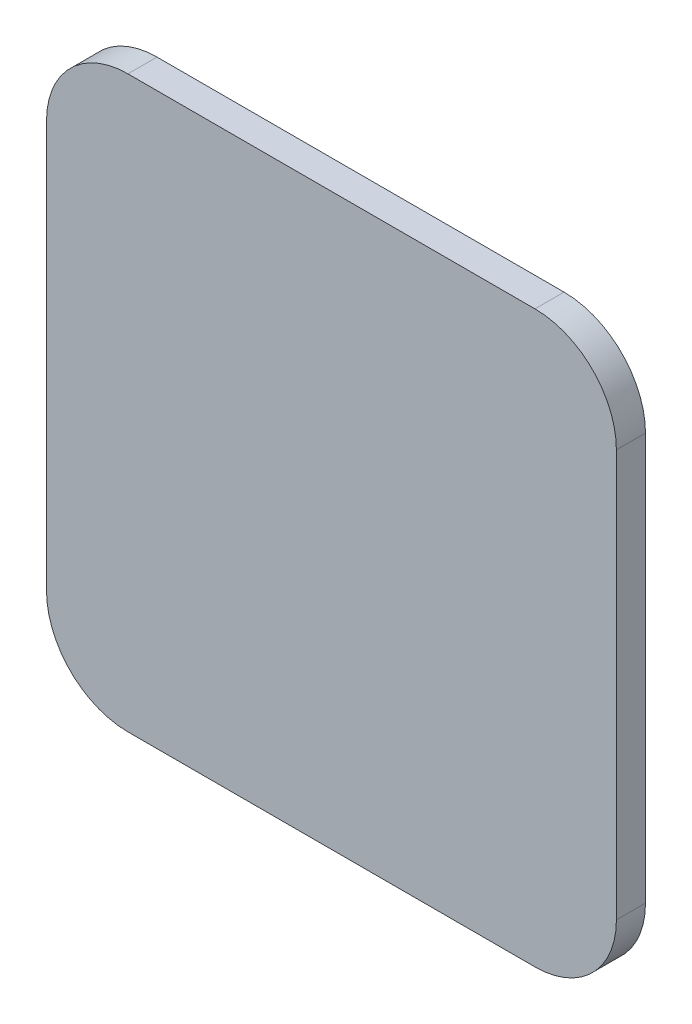
ISO-10303-21;
HEADER;
FILE_DESCRIPTION(('STEP AP214'),'2;1');
FILE_NAME('part.step','',(''),(''),'','','');
FILE_SCHEMA(('AUTOMOTIVE_DESIGN { 1 0 10303 214 1 1 1 1 }'));
ENDSEC;
DATA;
#1=APPLICATION_CONTEXT('core data for automotive mechanical design processes');
#2=APPLICATION_PROTOCOL_DEFINITION('international standard','automotive_design',2000,#1);
#3=PRODUCT_CONTEXT('',#1,'mechanical');
#4=PRODUCT('Part','Part','',(#3));
#5=PRODUCT_RELATED_PRODUCT_CATEGORY('part','',(#4));
#6=PRODUCT_DEFINITION_FORMATION('','',#4);
#7=PRODUCT_DEFINITION_CONTEXT('part definition',#1,'design');
#8=PRODUCT_DEFINITION('design','',#6,#7);
#9=PRODUCT_DEFINITION_SHAPE('','',#8);
#10=(LENGTH_UNIT() NAMED_UNIT(*) SI_UNIT(.MILLI.,.METRE.));
#11=(NAMED_UNIT(*) PLANE_ANGLE_UNIT() SI_UNIT($,.RADIAN.));
#12=(NAMED_UNIT(*) SI_UNIT($,.STERADIAN.) SOLID_ANGLE_UNIT());
#13=UNCERTAINTY_MEASURE_WITH_UNIT(LENGTH_MEASURE(1.E-05),#10,'distance_accuracy_value','');
#14=(GEOMETRIC_REPRESENTATION_CONTEXT(3) GLOBAL_UNCERTAINTY_ASSIGNED_CONTEXT((#13)) GLOBAL_UNIT_ASSIGNED_CONTEXT((#10,
#11,#12)) REPRESENTATION_CONTEXT('',''));
#15=CARTESIAN_POINT('',(0.,0.,0.));
#16=DIRECTION('',(0.,0.,1.));
#17=DIRECTION('',(1.,0.,0.));
#18=AXIS2_PLACEMENT_3D('',#15,#16,#17);
#19=CARTESIAN_POINT('',(0.,-53.086,-1.27));
#20=DIRECTION('',(0.,1.,0.));
#21=DIRECTION('',(-1.,0.,0.));
#22=AXIS2_PLACEMENT_3D('',#19,#20,#21);
#23=PLANE('',#22);
#24=DIRECTION('',(-1.,0.,0.));
#25=VECTOR('',#24,1.);
#26=CARTESIAN_POINT('',(0.,-53.086,0.));
#27=LINE('',#26,#25);
#28=CARTESIAN_POINT('',(5.69272615384614,-53.086,0.));
#29=VERTEX_POINT('',#28);
#30=CARTESIAN_POINT('',(-12.0872738461538,-53.086,0.));
#31=VERTEX_POINT('',#30);
#32=EDGE_CURVE('E149',#29,#31,#27,.T.);
#33=ORIENTED_EDGE('',*,*,#32,.T.);
#34=DIRECTION('',(0.,0.,1.));
#35=VECTOR('',#34,1.);
#36=CARTESIAN_POINT('',(-12.0872738461538,-53.086,-1.27));
#37=LINE('',#36,#35);
#38=CARTESIAN_POINT('',(-12.0872738461538,-53.086,-1.27));
#39=VERTEX_POINT('',#38);
#40=EDGE_CURVE('E11',#39,#31,#37,.T.);
#41=ORIENTED_EDGE('',*,*,#40,.F.);
#42=DIRECTION('',(-1.,0.,0.));
#43=VECTOR('',#42,1.);
#44=CARTESIAN_POINT('',(0.,-53.086,-1.27));
#45=LINE('',#44,#43);
#46=CARTESIAN_POINT('',(5.69272615384614,-53.086,-1.27));
#47=VERTEX_POINT('',#46);
#48=EDGE_CURVE('E183',#47,#39,#45,.T.);
#49=ORIENTED_EDGE('',*,*,#48,.F.);
#50=DIRECTION('',(0.,0.,1.));
#51=VECTOR('',#50,1.);
#52=CARTESIAN_POINT('',(5.69272615384614,-53.086,-1.27));
#53=LINE('',#52,#51);
#54=EDGE_CURVE('E38',#47,#29,#53,.T.);
#55=ORIENTED_EDGE('',*,*,#54,.T.);
#56=EDGE_LOOP('',(#33,#41,#49,#55));
#57=FACE_BOUND('',#56,.T.);
#58=ADVANCED_FACE('F35',(#57),#23,.F.);
#59=CARTESIAN_POINT('',(-12.0872738461538,-49.53,-1.27));
#60=DIRECTION('',(0.,0.,1.));
#61=DIRECTION('',(1.,0.,0.));
#62=AXIS2_PLACEMENT_3D('',#59,#60,#61);
#63=CYLINDRICAL_SURFACE('',#62,3.556);
#64=CARTESIAN_POINT('',(-12.0872738461538,-49.53,0.));
#65=DIRECTION('',(0.,0.,1.));
#66=DIRECTION('',(1.,0.,0.));
#67=AXIS2_PLACEMENT_3D('',#64,#65,#66);
#68=CIRCLE('',#67,3.556);
#69=CARTESIAN_POINT('',(-15.6432738461538,-49.53,0.));
#70=VERTEX_POINT('',#69);
#71=EDGE_CURVE('E93',#31,#70,#68,.F.);
#72=ORIENTED_EDGE('',*,*,#71,.T.);
#73=DIRECTION('',(0.,0.,1.));
#74=VECTOR('',#73,1.);
#75=CARTESIAN_POINT('',(-15.6432738461538,-49.53,-1.27));
#76=LINE('',#75,#74);
#77=CARTESIAN_POINT('',(-15.6432738461538,-49.53,-1.27));
#78=VERTEX_POINT('',#77);
#79=EDGE_CURVE('E43',#78,#70,#76,.T.);
#80=ORIENTED_EDGE('',*,*,#79,.F.);
#81=CARTESIAN_POINT('',(-12.0872738461538,-49.53,-1.27));
#82=DIRECTION('',(0.,0.,1.));
#83=DIRECTION('',(1.,0.,0.));
#84=AXIS2_PLACEMENT_3D('',#81,#82,#83);
#85=CIRCLE('',#84,3.556);
#86=EDGE_CURVE('E59',#39,#78,#85,.F.);
#87=ORIENTED_EDGE('',*,*,#86,.F.);
#88=ORIENTED_EDGE('',*,*,#40,.T.);
#89=EDGE_LOOP('',(#72,#80,#87,#88));
#90=FACE_BOUND('',#89,.T.);
#91=ADVANCED_FACE('F199',(#90),#63,.T.);
#92=CARTESIAN_POINT('',(-15.6432738461538,0.,-1.27));
#93=DIRECTION('',(-1.,0.,0.));
#94=DIRECTION('',(0.,-1.,0.));
#95=AXIS2_PLACEMENT_3D('',#92,#93,#94);
#96=PLANE('',#95);
#97=DIRECTION('',(0.,-1.,0.));
#98=VECTOR('',#97,1.);
#99=CARTESIAN_POINT('',(-15.6432738461538,0.,0.));
#100=LINE('',#99,#98);
#101=CARTESIAN_POINT('',(-15.6432738461538,-31.75,0.));
#102=VERTEX_POINT('',#101);
#103=EDGE_CURVE('E127',#102,#70,#100,.T.);
#104=ORIENTED_EDGE('',*,*,#103,.F.);
#105=DIRECTION('',(0.,0.,1.));
#106=VECTOR('',#105,1.);
#107=CARTESIAN_POINT('',(-15.6432738461538,-31.75,-1.27));
#108=LINE('',#107,#106);
#109=CARTESIAN_POINT('',(-15.6432738461538,-31.75,-1.27));
#110=VERTEX_POINT('',#109);
#111=EDGE_CURVE('E123',#110,#102,#108,.T.);
#112=ORIENTED_EDGE('',*,*,#111,.F.);
#113=DIRECTION('',(0.,-1.,0.));
#114=VECTOR('',#113,1.);
#115=CARTESIAN_POINT('',(-15.6432738461538,0.,-1.27));
#116=LINE('',#115,#114);
#117=EDGE_CURVE('E126',#110,#78,#116,.T.);
#118=ORIENTED_EDGE('',*,*,#117,.T.);
#119=ORIENTED_EDGE('',*,*,#79,.T.);
#120=EDGE_LOOP('',(#104,#112,#118,#119));
#121=FACE_BOUND('',#120,.T.);
#122=ADVANCED_FACE('F125',(#121),#96,.T.);
#123=CARTESIAN_POINT('',(-12.0872738461538,-31.75,-1.27));
#124=DIRECTION('',(0.,0.,1.));
#125=DIRECTION('',(1.,0.,0.));
#126=AXIS2_PLACEMENT_3D('',#123,#124,#125);
#127=CYLINDRICAL_SURFACE('',#126,3.556);
#128=CARTESIAN_POINT('',(-12.0872738461538,-31.75,0.));
#129=DIRECTION('',(0.,0.,1.));
#130=DIRECTION('',(1.,0.,0.));
#131=AXIS2_PLACEMENT_3D('',#128,#129,#130);
#132=CIRCLE('',#131,3.556);
#133=CARTESIAN_POINT('',(-12.0872738461538,-28.194,0.));
#134=VERTEX_POINT('',#133);
#135=EDGE_CURVE('E165',#134,#102,#132,.T.);
#136=ORIENTED_EDGE('',*,*,#135,.F.);
#137=DIRECTION('',(0.,0.,1.));
#138=VECTOR('',#137,1.);
#139=CARTESIAN_POINT('',(-12.0872738461538,-28.194,-1.27));
#140=LINE('',#139,#138);
#141=CARTESIAN_POINT('',(-12.0872738461538,-28.194,-1.27));
#142=VERTEX_POINT('',#141);
#143=EDGE_CURVE('E132',#142,#134,#140,.T.);
#144=ORIENTED_EDGE('',*,*,#143,.F.);
#145=CARTESIAN_POINT('',(-12.0872738461538,-31.75,-1.27));
#146=DIRECTION('',(0.,0.,1.));
#147=DIRECTION('',(1.,0.,0.));
#148=AXIS2_PLACEMENT_3D('',#145,#146,#147);
#149=CIRCLE('',#148,3.556);
#150=EDGE_CURVE('E138',#142,#110,#149,.T.);
#151=ORIENTED_EDGE('',*,*,#150,.T.);
#152=ORIENTED_EDGE('',*,*,#111,.T.);
#153=EDGE_LOOP('',(#136,#144,#151,#152));
#154=FACE_BOUND('',#153,.T.);
#155=ADVANCED_FACE('F141',(#154),#127,.T.);
#156=CARTESIAN_POINT('',(0.,-28.194,-1.27));
#157=DIRECTION('',(0.,1.,0.));
#158=DIRECTION('',(0.,0.,1.));
#159=AXIS2_PLACEMENT_3D('',#156,#157,#158);
#160=PLANE('',#159);
#161=DIRECTION('',(-1.,0.,0.));
#162=VECTOR('',#161,1.);
#163=CARTESIAN_POINT('',(0.,-28.194,0.));
#164=LINE('',#163,#162);
#165=CARTESIAN_POINT('',(5.69272615384616,-28.194,0.));
#166=VERTEX_POINT('',#165);
#167=EDGE_CURVE('E162',#166,#134,#164,.T.);
#168=ORIENTED_EDGE('',*,*,#167,.F.);
#169=DIRECTION('',(0.,0.,1.));
#170=VECTOR('',#169,1.);
#171=CARTESIAN_POINT('',(5.69272615384616,-28.194,-1.27));
#172=LINE('',#171,#170);
#173=CARTESIAN_POINT('',(5.69272615384616,-28.194,-1.27));
#174=VERTEX_POINT('',#173);
#175=EDGE_CURVE('E172',#174,#166,#172,.T.);
#176=ORIENTED_EDGE('',*,*,#175,.F.);
#177=DIRECTION('',(-1.,0.,0.));
#178=VECTOR('',#177,1.);
#179=CARTESIAN_POINT('',(0.,-28.194,-1.27));
#180=LINE('',#179,#178);
#181=EDGE_CURVE('E142',#174,#142,#180,.T.);
#182=ORIENTED_EDGE('',*,*,#181,.T.);
#183=ORIENTED_EDGE('',*,*,#143,.T.);
#184=EDGE_LOOP('',(#168,#176,#182,#183));
#185=FACE_BOUND('',#184,.T.);
#186=ADVANCED_FACE('F212',(#185),#160,.T.);
#187=CARTESIAN_POINT('',(5.69272615384616,-31.75,-1.27));
#188=DIRECTION('',(0.,0.,1.));
#189=DIRECTION('',(1.,0.,0.));
#190=AXIS2_PLACEMENT_3D('',#187,#188,#189);
#191=CYLINDRICAL_SURFACE('',#190,3.556);
#192=CARTESIAN_POINT('',(5.69272615384616,-31.75,0.));
#193=DIRECTION('',(0.,0.,1.));
#194=DIRECTION('',(1.,0.,0.));
#195=AXIS2_PLACEMENT_3D('',#192,#193,#194);
#196=CIRCLE('',#195,3.556);
#197=CARTESIAN_POINT('',(9.24872615384616,-31.75,0.));
#198=VERTEX_POINT('',#197);
#199=EDGE_CURVE('E159',#198,#166,#196,.T.);
#200=ORIENTED_EDGE('',*,*,#199,.F.);
#201=DIRECTION('',(0.,0.,1.));
#202=VECTOR('',#201,1.);
#203=CARTESIAN_POINT('',(9.24872615384616,-31.75,-1.27));
#204=LINE('',#203,#202);
#205=CARTESIAN_POINT('',(9.24872615384616,-31.75,-1.27));
#206=VERTEX_POINT('',#205);
#207=EDGE_CURVE('E174',#206,#198,#204,.T.);
#208=ORIENTED_EDGE('',*,*,#207,.F.);
#209=CARTESIAN_POINT('',(5.69272615384616,-31.75,-1.27));
#210=DIRECTION('',(0.,0.,1.));
#211=DIRECTION('',(1.,0.,0.));
#212=AXIS2_PLACEMENT_3D('',#209,#210,#211);
#213=CIRCLE('',#212,3.556);
#214=EDGE_CURVE('E144',#206,#174,#213,.T.);
#215=ORIENTED_EDGE('',*,*,#214,.T.);
#216=ORIENTED_EDGE('',*,*,#175,.T.);
#217=EDGE_LOOP('',(#200,#208,#215,#216));
#218=FACE_BOUND('',#217,.T.);
#219=ADVANCED_FACE('F195',(#218),#191,.T.);
#220=CARTESIAN_POINT('',(9.24872615384615,0.,-1.27));
#221=DIRECTION('',(1.,0.,0.));
#222=DIRECTION('',(0.,1.,0.));
#223=AXIS2_PLACEMENT_3D('',#220,#221,#222);
#224=PLANE('',#223);
#225=DIRECTION('',(0.,1.,0.));
#226=VECTOR('',#225,1.);
#227=CARTESIAN_POINT('',(9.24872615384615,0.,0.));
#228=LINE('',#227,#226);
#229=CARTESIAN_POINT('',(9.24872615384617,-49.53,0.));
#230=VERTEX_POINT('',#229);
#231=EDGE_CURVE('E156',#230,#198,#228,.T.);
#232=ORIENTED_EDGE('',*,*,#231,.F.);
#233=DIRECTION('',(0.,0.,1.));
#234=VECTOR('',#233,1.);
#235=CARTESIAN_POINT('',(9.24872615384617,-49.53,-1.27));
#236=LINE('',#235,#234);
#237=CARTESIAN_POINT('',(9.24872615384617,-49.53,-1.27));
#238=VERTEX_POINT('',#237);
#239=EDGE_CURVE('E175',#238,#230,#236,.T.);
#240=ORIENTED_EDGE('',*,*,#239,.F.);
#241=DIRECTION('',(0.,1.,0.));
#242=VECTOR('',#241,1.);
#243=CARTESIAN_POINT('',(9.24872615384615,0.,-1.27));
#244=LINE('',#243,#242);
#245=EDGE_CURVE('E226',#238,#206,#244,.T.);
#246=ORIENTED_EDGE('',*,*,#245,.T.);
#247=ORIENTED_EDGE('',*,*,#207,.T.);
#248=EDGE_LOOP('',(#232,#240,#246,#247));
#249=FACE_BOUND('',#248,.T.);
#250=ADVANCED_FACE('F188',(#249),#224,.T.);
#251=CARTESIAN_POINT('',(5.69272615384617,-49.53,-1.27));
#252=DIRECTION('',(0.,0.,1.));
#253=DIRECTION('',(1.,0.,0.));
#254=AXIS2_PLACEMENT_3D('',#251,#252,#253);
#255=CYLINDRICAL_SURFACE('',#254,3.556);
#256=CARTESIAN_POINT('',(5.69272615384617,-49.53,0.));
#257=DIRECTION('',(0.,0.,1.));
#258=DIRECTION('',(1.,0.,0.));
#259=AXIS2_PLACEMENT_3D('',#256,#257,#258);
#260=CIRCLE('',#259,3.556);
#261=EDGE_CURVE('E152',#29,#230,#260,.T.);
#262=ORIENTED_EDGE('',*,*,#261,.F.);
#263=ORIENTED_EDGE('',*,*,#54,.F.);
#264=CARTESIAN_POINT('',(5.69272615384617,-49.53,-1.27));
#265=DIRECTION('',(0.,0.,1.));
#266=DIRECTION('',(1.,0.,0.));
#267=AXIS2_PLACEMENT_3D('',#264,#265,#266);
#268=CIRCLE('',#267,3.556);
#269=EDGE_CURVE('E227',#47,#238,#268,.T.);
#270=ORIENTED_EDGE('',*,*,#269,.T.);
#271=ORIENTED_EDGE('',*,*,#239,.T.);
#272=EDGE_LOOP('',(#262,#263,#270,#271));
#273=FACE_BOUND('',#272,.T.);
#274=ADVANCED_FACE('F186',(#273),#255,.T.);
#275=CARTESIAN_POINT('',(0.,0.,-1.27));
#276=DIRECTION('',(0.,0.,1.));
#277=DIRECTION('',(1.,0.,0.));
#278=AXIS2_PLACEMENT_3D('',#275,#276,#277);
#279=PLANE('',#278);
#280=CARTESIAN_POINT('',(5.69272615384617,-49.53,-1.27));
#281=DIRECTION('',(0.,0.,1.));
#282=DIRECTION('',(1.,0.,0.));
#283=AXIS2_PLACEMENT_3D('',#280,#281,#282);
#284=CIRCLE('',#283,0.889);
#285=CARTESIAN_POINT('',(5.69272615384614,-50.419,-1.27));
#286=VERTEX_POINT('',#285);
#287=CARTESIAN_POINT('',(6.58172615384616,-49.53,-1.27));
#288=VERTEX_POINT('',#287);
#289=EDGE_CURVE('E168',#286,#288,#284,.T.);
#290=ORIENTED_EDGE('',*,*,#289,.T.);
#291=DIRECTION('',(0.,1.,0.));
#292=VECTOR('',#291,1.);
#293=CARTESIAN_POINT('',(6.58172615384616,0.,-1.27));
#294=LINE('',#293,#292);
#295=CARTESIAN_POINT('',(6.58172615384616,-31.75,-1.27));
#296=VERTEX_POINT('',#295);
#297=EDGE_CURVE('E232',#288,#296,#294,.T.);
#298=ORIENTED_EDGE('',*,*,#297,.T.);
#299=CARTESIAN_POINT('',(5.69272615384616,-31.75,-1.27));
#300=DIRECTION('',(0.,0.,1.));
#301=DIRECTION('',(1.,0.,0.));
#302=AXIS2_PLACEMENT_3D('',#299,#300,#301);
#303=CIRCLE('',#302,0.889);
#304=CARTESIAN_POINT('',(5.69272615384616,-30.861,-1.27));
#305=VERTEX_POINT('',#304);
#306=EDGE_CURVE('E235',#296,#305,#303,.T.);
#307=ORIENTED_EDGE('',*,*,#306,.T.);
#308=DIRECTION('',(-1.,0.,0.));
#309=VECTOR('',#308,1.);
#310=CARTESIAN_POINT('',(0.,-30.861,-1.27));
#311=LINE('',#310,#309);
#312=CARTESIAN_POINT('',(-12.0872738461538,-30.861,-1.27));
#313=VERTEX_POINT('',#312);
#314=EDGE_CURVE('E238',#305,#313,#311,.T.);
#315=ORIENTED_EDGE('',*,*,#314,.T.);
#316=CARTESIAN_POINT('',(-12.0872738461538,-31.75,-1.27));
#317=DIRECTION('',(0.,0.,1.));
#318=DIRECTION('',(1.,0.,0.));
#319=AXIS2_PLACEMENT_3D('',#316,#317,#318);
#320=CIRCLE('',#319,0.889000000000002);
#321=CARTESIAN_POINT('',(-12.9762738461538,-31.75,-1.27));
#322=VERTEX_POINT('',#321);
#323=EDGE_CURVE('E241',#313,#322,#320,.T.);
#324=ORIENTED_EDGE('',*,*,#323,.T.);
#325=DIRECTION('',(0.,-1.,0.));
#326=VECTOR('',#325,1.);
#327=CARTESIAN_POINT('',(-12.9762738461538,0.,-1.27));
#328=LINE('',#327,#326);
#329=CARTESIAN_POINT('',(-12.9762738461538,-49.53,-1.27));
#330=VERTEX_POINT('',#329);
#331=EDGE_CURVE('E244',#322,#330,#328,.T.);
#332=ORIENTED_EDGE('',*,*,#331,.T.);
#333=CARTESIAN_POINT('',(-12.0872738461538,-49.53,-1.27));
#334=DIRECTION('',(0.,0.,1.));
#335=DIRECTION('',(1.,0.,0.));
#336=AXIS2_PLACEMENT_3D('',#333,#334,#335);
#337=CIRCLE('',#336,0.889000000000002);
#338=CARTESIAN_POINT('',(-12.0872738461538,-50.419,-1.27));
#339=VERTEX_POINT('',#338);
#340=EDGE_CURVE('E247',#339,#330,#337,.F.);
#341=ORIENTED_EDGE('',*,*,#340,.F.);
#342=DIRECTION('',(-1.,0.,0.));
#343=VECTOR('',#342,1.);
#344=CARTESIAN_POINT('',(0.,-50.419,-1.27));
#345=LINE('',#344,#343);
#346=EDGE_CURVE('E250',#286,#339,#345,.T.);
#347=ORIENTED_EDGE('',*,*,#346,.F.);
#348=EDGE_LOOP('',(#290,#298,#307,#315,#324,#332,#341,#347));
#349=FACE_BOUND('',#348,.T.);
#350=ORIENTED_EDGE('',*,*,#48,.T.);
#351=ORIENTED_EDGE('',*,*,#86,.T.);
#352=ORIENTED_EDGE('',*,*,#117,.F.);
#353=ORIENTED_EDGE('',*,*,#150,.F.);
#354=ORIENTED_EDGE('',*,*,#181,.F.);
#355=ORIENTED_EDGE('',*,*,#214,.F.);
#356=ORIENTED_EDGE('',*,*,#245,.F.);
#357=ORIENTED_EDGE('',*,*,#269,.F.);
#358=EDGE_LOOP('',(#350,#351,#352,#353,#354,#355,#356,#357));
#359=FACE_BOUND('',#358,.T.);
#360=ADVANCED_FACE('F136',(#349,#359),#279,.F.);
#361=CARTESIAN_POINT('',(0.,0.,0.));
#362=DIRECTION('',(0.,0.,1.));
#363=DIRECTION('',(1.,0.,0.));
#364=AXIS2_PLACEMENT_3D('',#361,#362,#363);
#365=PLANE('',#364);
#366=ORIENTED_EDGE('',*,*,#32,.F.);
#367=ORIENTED_EDGE('',*,*,#261,.T.);
#368=ORIENTED_EDGE('',*,*,#231,.T.);
#369=ORIENTED_EDGE('',*,*,#199,.T.);
#370=ORIENTED_EDGE('',*,*,#167,.T.);
#371=ORIENTED_EDGE('',*,*,#135,.T.);
#372=ORIENTED_EDGE('',*,*,#103,.T.);
#373=ORIENTED_EDGE('',*,*,#71,.F.);
#374=EDGE_LOOP('',(#366,#367,#368,#369,#370,#371,#372,#373));
#375=FACE_BOUND('',#374,.T.);
#376=ADVANCED_FACE('F185',(#375),#365,.T.);
#377=CARTESIAN_POINT('',(0.,-50.419,-2.54));
#378=DIRECTION('',(0.,1.,0.));
#379=DIRECTION('',(0.,0.,1.));
#380=AXIS2_PLACEMENT_3D('',#377,#378,#379);
#381=PLANE('',#380);
#382=DIRECTION('',(0.,0.,1.));
#383=VECTOR('',#382,1.);
#384=CARTESIAN_POINT('',(5.69272615384614,-50.419,-2.54));
#385=LINE('',#384,#383);
#386=CARTESIAN_POINT('',(5.69272615384614,-50.419,-2.54));
#387=VERTEX_POINT('',#386);
#388=EDGE_CURVE('E255',#387,#286,#385,.T.);
#389=ORIENTED_EDGE('',*,*,#388,.T.);
#390=ORIENTED_EDGE('',*,*,#346,.T.);
#391=DIRECTION('',(0.,0.,1.));
#392=VECTOR('',#391,1.);
#393=CARTESIAN_POINT('',(-12.0872738461538,-50.419,-2.54));
#394=LINE('',#393,#392);
#395=CARTESIAN_POINT('',(-12.0872738461538,-50.419,-2.54));
#396=VERTEX_POINT('',#395);
#397=EDGE_CURVE('E153',#396,#339,#394,.T.);
#398=ORIENTED_EDGE('',*,*,#397,.F.);
#399=DIRECTION('',(-1.,0.,0.));
#400=VECTOR('',#399,1.);
#401=CARTESIAN_POINT('',(0.,-50.419,-2.54));
#402=LINE('',#401,#400);
#403=EDGE_CURVE('E296',#387,#396,#402,.T.);
#404=ORIENTED_EDGE('',*,*,#403,.F.);
#405=EDGE_LOOP('',(#389,#390,#398,#404));
#406=FACE_BOUND('',#405,.T.);
#407=ADVANCED_FACE('F396',(#406),#381,.F.);
#408=CARTESIAN_POINT('',(-12.0872738461538,-49.53,-2.54));
#409=DIRECTION('',(0.,0.,1.));
#410=DIRECTION('',(1.,0.,0.));
#411=AXIS2_PLACEMENT_3D('',#408,#409,#410);
#412=CYLINDRICAL_SURFACE('',#411,0.889000000000002);
#413=ORIENTED_EDGE('',*,*,#397,.T.);
#414=ORIENTED_EDGE('',*,*,#340,.T.);
#415=DIRECTION('',(0.,0.,1.));
#416=VECTOR('',#415,1.);
#417=CARTESIAN_POINT('',(-12.9762738461538,-49.53,-2.54));
#418=LINE('',#417,#416);
#419=CARTESIAN_POINT('',(-12.9762738461538,-49.53,-2.54));
#420=VERTEX_POINT('',#419);
#421=EDGE_CURVE('E272',#420,#330,#418,.T.);
#422=ORIENTED_EDGE('',*,*,#421,.F.);
#423=CARTESIAN_POINT('',(-12.0872738461538,-49.53,-2.54));
#424=DIRECTION('',(0.,0.,1.));
#425=DIRECTION('',(1.,0.,0.));
#426=AXIS2_PLACEMENT_3D('',#423,#424,#425);
#427=CIRCLE('',#426,0.889000000000002);
#428=EDGE_CURVE('E258',#396,#420,#427,.F.);
#429=ORIENTED_EDGE('',*,*,#428,.F.);
#430=EDGE_LOOP('',(#413,#414,#422,#429));
#431=FACE_BOUND('',#430,.T.);
#432=ADVANCED_FACE('F398',(#431),#412,.T.);
#433=CARTESIAN_POINT('',(-12.9762738461538,0.,-2.54));
#434=DIRECTION('',(-1.,0.,0.));
#435=DIRECTION('',(0.,0.,1.));
#436=AXIS2_PLACEMENT_3D('',#433,#434,#435);
#437=PLANE('',#436);
#438=ORIENTED_EDGE('',*,*,#331,.F.);
#439=DIRECTION('',(0.,0.,1.));
#440=VECTOR('',#439,1.);
#441=CARTESIAN_POINT('',(-12.9762738461538,-31.75,-2.54));
#442=LINE('',#441,#440);
#443=CARTESIAN_POINT('',(-12.9762738461538,-31.75,-2.54));
#444=VERTEX_POINT('',#443);
#445=EDGE_CURVE('E269',#444,#322,#442,.T.);
#446=ORIENTED_EDGE('',*,*,#445,.F.);
#447=DIRECTION('',(0.,-1.,0.));
#448=VECTOR('',#447,1.);
#449=CARTESIAN_POINT('',(-12.9762738461538,0.,-2.54));
#450=LINE('',#449,#448);
#451=EDGE_CURVE('E279',#444,#420,#450,.T.);
#452=ORIENTED_EDGE('',*,*,#451,.T.);
#453=ORIENTED_EDGE('',*,*,#421,.T.);
#454=EDGE_LOOP('',(#438,#446,#452,#453));
#455=FACE_BOUND('',#454,.T.);
#456=ADVANCED_FACE('F400',(#455),#437,.T.);
#457=CARTESIAN_POINT('',(-12.0872738461538,-31.75,-2.54));
#458=DIRECTION('',(0.,0.,1.));
#459=DIRECTION('',(1.,0.,0.));
#460=AXIS2_PLACEMENT_3D('',#457,#458,#459);
#461=CYLINDRICAL_SURFACE('',#460,0.889000000000002);
#462=ORIENTED_EDGE('',*,*,#323,.F.);
#463=DIRECTION('',(0.,0.,1.));
#464=VECTOR('',#463,1.);
#465=CARTESIAN_POINT('',(-12.0872738461538,-30.861,-2.54));
#466=LINE('',#465,#464);
#467=CARTESIAN_POINT('',(-12.0872738461538,-30.861,-2.54));
#468=VERTEX_POINT('',#467);
#469=EDGE_CURVE('E266',#468,#313,#466,.T.);
#470=ORIENTED_EDGE('',*,*,#469,.F.);
#471=CARTESIAN_POINT('',(-12.0872738461538,-31.75,-2.54));
#472=DIRECTION('',(0.,0.,1.));
#473=DIRECTION('',(1.,0.,0.));
#474=AXIS2_PLACEMENT_3D('',#471,#472,#473);
#475=CIRCLE('',#474,0.889000000000002);
#476=EDGE_CURVE('E282',#468,#444,#475,.T.);
#477=ORIENTED_EDGE('',*,*,#476,.T.);
#478=ORIENTED_EDGE('',*,*,#445,.T.);
#479=EDGE_LOOP('',(#462,#470,#477,#478));
#480=FACE_BOUND('',#479,.T.);
#481=ADVANCED_FACE('F403',(#480),#461,.T.);
#482=CARTESIAN_POINT('',(0.,-30.861,-2.54));
#483=DIRECTION('',(0.,1.,0.));
#484=DIRECTION('',(0.,0.,1.));
#485=AXIS2_PLACEMENT_3D('',#482,#483,#484);
#486=PLANE('',#485);
#487=ORIENTED_EDGE('',*,*,#314,.F.);
#488=DIRECTION('',(0.,0.,1.));
#489=VECTOR('',#488,1.);
#490=CARTESIAN_POINT('',(5.69272615384616,-30.861,-2.54));
#491=LINE('',#490,#489);
#492=CARTESIAN_POINT('',(5.69272615384616,-30.861,-2.54));
#493=VERTEX_POINT('',#492);
#494=EDGE_CURVE('E263',#493,#305,#491,.T.);
#495=ORIENTED_EDGE('',*,*,#494,.F.);
#496=DIRECTION('',(-1.,0.,0.));
#497=VECTOR('',#496,1.);
#498=CARTESIAN_POINT('',(0.,-30.861,-2.54));
#499=LINE('',#498,#497);
#500=EDGE_CURVE('E285',#493,#468,#499,.T.);
#501=ORIENTED_EDGE('',*,*,#500,.T.);
#502=ORIENTED_EDGE('',*,*,#469,.T.);
#503=EDGE_LOOP('',(#487,#495,#501,#502));
#504=FACE_BOUND('',#503,.T.);
#505=ADVANCED_FACE('F410',(#504),#486,.T.);
#506=CARTESIAN_POINT('',(5.69272615384616,-31.75,-2.54));
#507=DIRECTION('',(0.,0.,1.));
#508=DIRECTION('',(1.,0.,0.));
#509=AXIS2_PLACEMENT_3D('',#506,#507,#508);
#510=CYLINDRICAL_SURFACE('',#509,0.889);
#511=ORIENTED_EDGE('',*,*,#306,.F.);
#512=DIRECTION('',(0.,0.,1.));
#513=VECTOR('',#512,1.);
#514=CARTESIAN_POINT('',(6.58172615384616,-31.75,-2.54));
#515=LINE('',#514,#513);
#516=CARTESIAN_POINT('',(6.58172615384616,-31.75,-2.54));
#517=VERTEX_POINT('',#516);
#518=EDGE_CURVE('E260',#517,#296,#515,.T.);
#519=ORIENTED_EDGE('',*,*,#518,.F.);
#520=CARTESIAN_POINT('',(5.69272615384616,-31.75,-2.54));
#521=DIRECTION('',(0.,0.,1.));
#522=DIRECTION('',(1.,0.,0.));
#523=AXIS2_PLACEMENT_3D('',#520,#521,#522);
#524=CIRCLE('',#523,0.889);
#525=EDGE_CURVE('E288',#517,#493,#524,.T.);
#526=ORIENTED_EDGE('',*,*,#525,.T.);
#527=ORIENTED_EDGE('',*,*,#494,.T.);
#528=EDGE_LOOP('',(#511,#519,#526,#527));
#529=FACE_BOUND('',#528,.T.);
#530=ADVANCED_FACE('F412',(#529),#510,.T.);
#531=CARTESIAN_POINT('',(6.58172615384616,0.,-2.54));
#532=DIRECTION('',(1.,0.,0.));
#533=DIRECTION('',(0.,0.,-1.));
#534=AXIS2_PLACEMENT_3D('',#531,#532,#533);
#535=PLANE('',#534);
#536=ORIENTED_EDGE('',*,*,#297,.F.);
#537=DIRECTION('',(0.,0.,1.));
#538=VECTOR('',#537,1.);
#539=CARTESIAN_POINT('',(6.58172615384616,-49.53,-2.54));
#540=LINE('',#539,#538);
#541=CARTESIAN_POINT('',(6.58172615384616,-49.53,-2.54));
#542=VERTEX_POINT('',#541);
#543=EDGE_CURVE('E101',#542,#288,#540,.T.);
#544=ORIENTED_EDGE('',*,*,#543,.F.);
#545=DIRECTION('',(0.,1.,0.));
#546=VECTOR('',#545,1.);
#547=CARTESIAN_POINT('',(6.58172615384616,0.,-2.54));
#548=LINE('',#547,#546);
#549=EDGE_CURVE('E291',#542,#517,#548,.T.);
#550=ORIENTED_EDGE('',*,*,#549,.T.);
#551=ORIENTED_EDGE('',*,*,#518,.T.);
#552=EDGE_LOOP('',(#536,#544,#550,#551));
#553=FACE_BOUND('',#552,.T.);
#554=ADVANCED_FACE('F414',(#553),#535,.T.);
#555=CARTESIAN_POINT('',(5.69272615384617,-49.53,-2.54));
#556=DIRECTION('',(0.,0.,1.));
#557=DIRECTION('',(1.,0.,0.));
#558=AXIS2_PLACEMENT_3D('',#555,#556,#557);
#559=CYLINDRICAL_SURFACE('',#558,0.889);
#560=ORIENTED_EDGE('',*,*,#289,.F.);
#561=ORIENTED_EDGE('',*,*,#388,.F.);
#562=CARTESIAN_POINT('',(5.69272615384617,-49.53,-2.54));
#563=DIRECTION('',(0.,0.,1.));
#564=DIRECTION('',(1.,0.,0.));
#565=AXIS2_PLACEMENT_3D('',#562,#563,#564);
#566=CIRCLE('',#565,0.889);
#567=EDGE_CURVE('E294',#387,#542,#566,.T.);
#568=ORIENTED_EDGE('',*,*,#567,.T.);
#569=ORIENTED_EDGE('',*,*,#543,.T.);
#570=EDGE_LOOP('',(#560,#561,#568,#569));
#571=FACE_BOUND('',#570,.T.);
#572=ADVANCED_FACE('F417',(#571),#559,.T.);
#573=CARTESIAN_POINT('',(0.,0.,-2.54));
#574=DIRECTION('',(0.,0.,1.));
#575=DIRECTION('',(1.,0.,0.));
#576=AXIS2_PLACEMENT_3D('',#573,#574,#575);
#577=PLANE('',#576);
#578=DIRECTION('',(-1.,0.,0.));
#579=VECTOR('',#578,1.);
#580=CARTESIAN_POINT('',(0.,-49.149,-2.54));
#581=LINE('',#580,#579);
#582=CARTESIAN_POINT('',(5.31172615384616,-49.149,-2.54));
#583=VERTEX_POINT('',#582);
#584=CARTESIAN_POINT('',(-11.7062738461538,-49.149,-2.54));
#585=VERTEX_POINT('',#584);
#586=EDGE_CURVE('E317',#583,#585,#581,.T.);
#587=ORIENTED_EDGE('',*,*,#586,.F.);
#588=DIRECTION('',(0.,-1.,0.));
#589=VECTOR('',#588,1.);
#590=CARTESIAN_POINT('',(5.31172615384616,0.,-2.54));
#591=LINE('',#590,#589);
#592=CARTESIAN_POINT('',(5.31172615384616,-32.131,-2.54));
#593=VERTEX_POINT('',#592);
#594=EDGE_CURVE('E51',#593,#583,#591,.T.);
#595=ORIENTED_EDGE('',*,*,#594,.F.);
#596=DIRECTION('',(1.,0.,0.));
#597=VECTOR('',#596,1.);
#598=CARTESIAN_POINT('',(0.,-32.131,-2.54));
#599=LINE('',#598,#597);
#600=CARTESIAN_POINT('',(-11.7062738461538,-32.131,-2.54));
#601=VERTEX_POINT('',#600);
#602=EDGE_CURVE('E310',#601,#593,#599,.T.);
#603=ORIENTED_EDGE('',*,*,#602,.F.);
#604=DIRECTION('',(0.,1.,0.));
#605=VECTOR('',#604,1.);
#606=CARTESIAN_POINT('',(-11.7062738461538,0.,-2.54));
#607=LINE('',#606,#605);
#608=EDGE_CURVE('E314',#585,#601,#607,.T.);
#609=ORIENTED_EDGE('',*,*,#608,.F.);
#610=EDGE_LOOP('',(#587,#595,#603,#609));
#611=FACE_BOUND('',#610,.T.);
#612=ORIENTED_EDGE('',*,*,#403,.T.);
#613=ORIENTED_EDGE('',*,*,#428,.T.);
#614=ORIENTED_EDGE('',*,*,#451,.F.);
#615=ORIENTED_EDGE('',*,*,#476,.F.);
#616=ORIENTED_EDGE('',*,*,#500,.F.);
#617=ORIENTED_EDGE('',*,*,#525,.F.);
#618=ORIENTED_EDGE('',*,*,#549,.F.);
#619=ORIENTED_EDGE('',*,*,#567,.F.);
#620=EDGE_LOOP('',(#612,#613,#614,#615,#616,#617,#618,#619));
#621=FACE_BOUND('',#620,.T.);
#622=ADVANCED_FACE('F407',(#611,#621),#577,.F.);
#623=CARTESIAN_POINT('',(5.31172615384616,0.,-0.762));
#624=DIRECTION('',(1.,0.,0.));
#625=DIRECTION('',(0.,0.,-1.));
#626=AXIS2_PLACEMENT_3D('',#623,#624,#625);
#627=PLANE('',#626);
#628=ORIENTED_EDGE('',*,*,#594,.T.);
#629=DIRECTION('',(0.,0.,-1.));
#630=VECTOR('',#629,1.);
#631=CARTESIAN_POINT('',(5.31172615384616,-49.149,-0.762));
#632=LINE('',#631,#630);
#633=CARTESIAN_POINT('',(5.31172615384616,-49.149,-0.762));
#634=VERTEX_POINT('',#633);
#635=EDGE_CURVE('E300',#634,#583,#632,.T.);
#636=ORIENTED_EDGE('',*,*,#635,.F.);
#637=DIRECTION('',(0.,-1.,0.));
#638=VECTOR('',#637,1.);
#639=CARTESIAN_POINT('',(5.31172615384616,0.,-0.762));
#640=LINE('',#639,#638);
#641=CARTESIAN_POINT('',(5.31172615384616,-32.131,-0.762));
#642=VERTEX_POINT('',#641);
#643=EDGE_CURVE('E313',#642,#634,#640,.T.);
#644=ORIENTED_EDGE('',*,*,#643,.F.);
#645=DIRECTION('',(0.,0.,-1.));
#646=VECTOR('',#645,1.);
#647=CARTESIAN_POINT('',(5.31172615384616,-32.131,-0.762));
#648=LINE('',#647,#646);
#649=EDGE_CURVE('E299',#642,#593,#648,.T.);
#650=ORIENTED_EDGE('',*,*,#649,.T.);
#651=EDGE_LOOP('',(#628,#636,#644,#650));
#652=FACE_BOUND('',#651,.T.);
#653=ADVANCED_FACE('F340',(#652),#627,.F.);
#654=CARTESIAN_POINT('',(0.,-32.131,-0.762));
#655=DIRECTION('',(0.,1.,0.));
#656=DIRECTION('',(0.,0.,1.));
#657=AXIS2_PLACEMENT_3D('',#654,#655,#656);
#658=PLANE('',#657);
#659=ORIENTED_EDGE('',*,*,#602,.T.);
#660=ORIENTED_EDGE('',*,*,#649,.F.);
#661=DIRECTION('',(1.,0.,0.));
#662=VECTOR('',#661,1.);
#663=CARTESIAN_POINT('',(0.,-32.131,-0.762));
#664=LINE('',#663,#662);
#665=CARTESIAN_POINT('',(-11.7062738461538,-32.131,-0.762));
#666=VERTEX_POINT('',#665);
#667=EDGE_CURVE('E303',#666,#642,#664,.T.);
#668=ORIENTED_EDGE('',*,*,#667,.F.);
#669=DIRECTION('',(0.,0.,-1.));
#670=VECTOR('',#669,1.);
#671=CARTESIAN_POINT('',(-11.7062738461538,-32.131,-0.762));
#672=LINE('',#671,#670);
#673=EDGE_CURVE('E306',#666,#601,#672,.T.);
#674=ORIENTED_EDGE('',*,*,#673,.T.);
#675=EDGE_LOOP('',(#659,#660,#668,#674));
#676=FACE_BOUND('',#675,.T.);
#677=ADVANCED_FACE('F546',(#676),#658,.F.);
#678=CARTESIAN_POINT('',(-11.7062738461538,0.,-0.762));
#679=DIRECTION('',(-1.,0.,0.));
#680=DIRECTION('',(0.,0.,1.));
#681=AXIS2_PLACEMENT_3D('',#678,#679,#680);
#682=PLANE('',#681);
#683=ORIENTED_EDGE('',*,*,#608,.T.);
#684=ORIENTED_EDGE('',*,*,#673,.F.);
#685=DIRECTION('',(0.,1.,0.));
#686=VECTOR('',#685,1.);
#687=CARTESIAN_POINT('',(-11.7062738461538,0.,-0.762));
#688=LINE('',#687,#686);
#689=CARTESIAN_POINT('',(-11.7062738461538,-49.149,-0.762));
#690=VERTEX_POINT('',#689);
#691=EDGE_CURVE('E323',#690,#666,#688,.T.);
#692=ORIENTED_EDGE('',*,*,#691,.F.);
#693=DIRECTION('',(0.,0.,-1.));
#694=VECTOR('',#693,1.);
#695=CARTESIAN_POINT('',(-11.7062738461538,-49.149,-0.762));
#696=LINE('',#695,#694);
#697=EDGE_CURVE('E302',#690,#585,#696,.T.);
#698=ORIENTED_EDGE('',*,*,#697,.T.);
#699=EDGE_LOOP('',(#683,#684,#692,#698));
#700=FACE_BOUND('',#699,.T.);
#701=ADVANCED_FACE('F554',(#700),#682,.F.);
#702=CARTESIAN_POINT('',(0.,-49.149,-0.762));
#703=DIRECTION('',(0.,-1.,0.));
#704=DIRECTION('',(0.,0.,-1.));
#705=AXIS2_PLACEMENT_3D('',#702,#703,#704);
#706=PLANE('',#705);
#707=ORIENTED_EDGE('',*,*,#586,.T.);
#708=ORIENTED_EDGE('',*,*,#697,.F.);
#709=DIRECTION('',(-1.,0.,0.));
#710=VECTOR('',#709,1.);
#711=CARTESIAN_POINT('',(0.,-49.149,-0.762));
#712=LINE('',#711,#710);
#713=EDGE_CURVE('E326',#634,#690,#712,.T.);
#714=ORIENTED_EDGE('',*,*,#713,.F.);
#715=ORIENTED_EDGE('',*,*,#635,.T.);
#716=EDGE_LOOP('',(#707,#708,#714,#715));
#717=FACE_BOUND('',#716,.T.);
#718=ADVANCED_FACE('F562',(#717),#706,.F.);
#719=CARTESIAN_POINT('',(0.,0.,-0.762));
#720=DIRECTION('',(0.,0.,-1.));
#721=DIRECTION('',(-1.,0.,0.));
#722=AXIS2_PLACEMENT_3D('',#719,#720,#721);
#723=PLANE('',#722);
#724=ORIENTED_EDGE('',*,*,#643,.T.);
#725=ORIENTED_EDGE('',*,*,#713,.T.);
#726=ORIENTED_EDGE('',*,*,#691,.T.);
#727=ORIENTED_EDGE('',*,*,#667,.T.);
#728=EDGE_LOOP('',(#724,#725,#726,#727));
#729=FACE_BOUND('',#728,.T.);
#730=ADVANCED_FACE('F333',(#729),#723,.T.);
#731=CLOSED_SHELL('',(#58,#91,#122,#155,#186,#219,#250,#274,#360,#376,#407,#432,#456,#481,#505,
#530,#554,#572,#622,#653,#677,#701,#718,#730));
#732=MANIFOLD_SOLID_BREP('B2',#731);
#733=ADVANCED_BREP_SHAPE_REPRESENTATION('',(#18,#732),#14);
#734=SHAPE_DEFINITION_REPRESENTATION(#9,#733);
ENDSEC;
END-ISO-10303-21;
